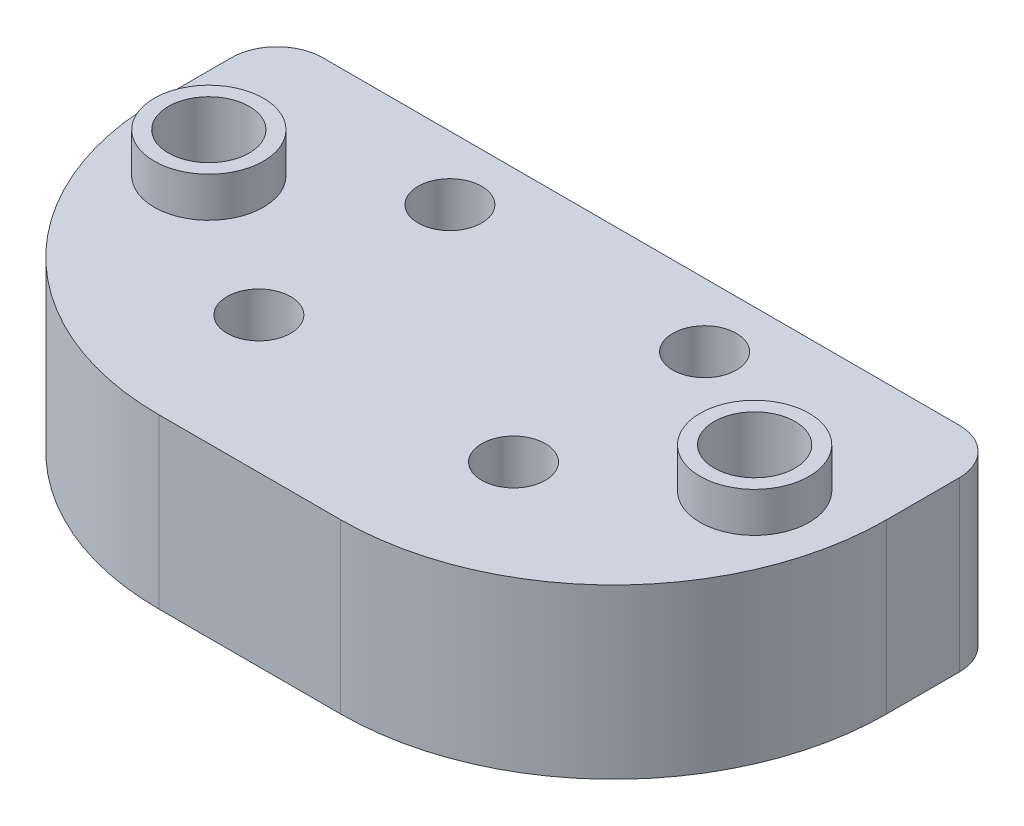
ISO-10303-21;
HEADER;
FILE_DESCRIPTION(('STEP AP214'),'2;1');
FILE_NAME('part.step','',(''),(''),'','','');
FILE_SCHEMA(('AUTOMOTIVE_DESIGN { 1 0 10303 214 1 1 1 1 }'));
ENDSEC;
DATA;
#1=APPLICATION_CONTEXT('core data for automotive mechanical design processes');
#2=APPLICATION_PROTOCOL_DEFINITION('international standard','automotive_design',2000,#1);
#3=PRODUCT_CONTEXT('',#1,'mechanical');
#4=PRODUCT('Part','Part','',(#3));
#5=PRODUCT_RELATED_PRODUCT_CATEGORY('part','',(#4));
#6=PRODUCT_DEFINITION_FORMATION('','',#4);
#7=PRODUCT_DEFINITION_CONTEXT('part definition',#1,'design');
#8=PRODUCT_DEFINITION('design','',#6,#7);
#9=PRODUCT_DEFINITION_SHAPE('','',#8);
#10=(LENGTH_UNIT() NAMED_UNIT(*) SI_UNIT(.MILLI.,.METRE.));
#11=(NAMED_UNIT(*) PLANE_ANGLE_UNIT() SI_UNIT($,.RADIAN.));
#12=(NAMED_UNIT(*) SI_UNIT($,.STERADIAN.) SOLID_ANGLE_UNIT());
#13=UNCERTAINTY_MEASURE_WITH_UNIT(LENGTH_MEASURE(1.E-05),#10,'distance_accuracy_value','');
#14=(GEOMETRIC_REPRESENTATION_CONTEXT(3) GLOBAL_UNCERTAINTY_ASSIGNED_CONTEXT((#13)) GLOBAL_UNIT_ASSIGNED_CONTEXT((#10,
#11,#12)) REPRESENTATION_CONTEXT('',''));
#15=CARTESIAN_POINT('',(0.,0.,0.));
#16=DIRECTION('',(0.,0.,1.));
#17=DIRECTION('',(1.,0.,0.));
#18=AXIS2_PLACEMENT_3D('',#15,#16,#17);
#19=CARTESIAN_POINT('',(80.,18.5,0.));
#20=DIRECTION('',(1.,0.,0.));
#21=DIRECTION('',(0.,0.,-1.));
#22=AXIS2_PLACEMENT_3D('',#19,#20,#21);
#23=PLANE('',#22);
#24=DIRECTION('',(0.,0.,1.));
#25=VECTOR('',#24,1.);
#26=CARTESIAN_POINT('',(80.,0.,0.));
#27=LINE('',#26,#25);
#28=CARTESIAN_POINT('',(80.,0.,13.));
#29=VERTEX_POINT('',#28);
#30=CARTESIAN_POINT('',(80.,0.,21.));
#31=VERTEX_POINT('',#30);
#32=EDGE_CURVE('E180',#29,#31,#27,.T.);
#33=ORIENTED_EDGE('',*,*,#32,.F.);
#34=DIRECTION('',(0.,-1.,0.));
#35=VECTOR('',#34,1.);
#36=CARTESIAN_POINT('',(80.,18.5,13.));
#37=LINE('',#36,#35);
#38=CARTESIAN_POINT('',(80.,18.5,13.));
#39=VERTEX_POINT('',#38);
#40=EDGE_CURVE('E11',#29,#39,#37,.F.);
#41=ORIENTED_EDGE('',*,*,#40,.T.);
#42=DIRECTION('',(0.,0.,1.));
#43=VECTOR('',#42,1.);
#44=CARTESIAN_POINT('',(80.,18.5,0.));
#45=LINE('',#44,#43);
#46=CARTESIAN_POINT('',(80.,18.5,21.));
#47=VERTEX_POINT('',#46);
#48=EDGE_CURVE('E137',#39,#47,#45,.T.);
#49=ORIENTED_EDGE('',*,*,#48,.T.);
#50=DIRECTION('',(0.,-1.,0.));
#51=VECTOR('',#50,1.);
#52=CARTESIAN_POINT('',(80.,0.,21.));
#53=LINE('',#52,#51);
#54=EDGE_CURVE('E147',#47,#31,#53,.T.);
#55=ORIENTED_EDGE('',*,*,#54,.T.);
#56=EDGE_LOOP('',(#33,#41,#49,#55));
#57=FACE_BOUND('',#56,.T.);
#58=ADVANCED_FACE('F34',(#57),#23,.T.);
#59=CARTESIAN_POINT('',(0.,18.5,7.99999999999999));
#60=DIRECTION('',(0.,0.,-1.));
#61=DIRECTION('',(-1.,0.,0.));
#62=AXIS2_PLACEMENT_3D('',#59,#60,#61);
#63=PLANE('',#62);
#64=DIRECTION('',(1.,0.,0.));
#65=VECTOR('',#64,1.);
#66=CARTESIAN_POINT('',(0.,0.,7.99999999999999));
#67=LINE('',#66,#65);
#68=CARTESIAN_POINT('',(5.,0.,7.99999999999999));
#69=VERTEX_POINT('',#68);
#70=CARTESIAN_POINT('',(75.,0.,7.99999999999999));
#71=VERTEX_POINT('',#70);
#72=EDGE_CURVE('E131',#69,#71,#67,.T.);
#73=ORIENTED_EDGE('',*,*,#72,.F.);
#74=DIRECTION('',(0.,-1.,0.));
#75=VECTOR('',#74,1.);
#76=CARTESIAN_POINT('',(5.,18.5,7.99999999999999));
#77=LINE('',#76,#75);
#78=CARTESIAN_POINT('',(5.,18.5,7.99999999999999));
#79=VERTEX_POINT('',#78);
#80=EDGE_CURVE('E160',#69,#79,#77,.F.);
#81=ORIENTED_EDGE('',*,*,#80,.T.);
#82=DIRECTION('',(1.,0.,0.));
#83=VECTOR('',#82,1.);
#84=CARTESIAN_POINT('',(0.,18.5,7.99999999999999));
#85=LINE('',#84,#83);
#86=CARTESIAN_POINT('',(75.,18.5,7.99999999999999));
#87=VERTEX_POINT('',#86);
#88=EDGE_CURVE('E167',#79,#87,#85,.T.);
#89=ORIENTED_EDGE('',*,*,#88,.T.);
#90=DIRECTION('',(0.,-1.,0.));
#91=VECTOR('',#90,1.);
#92=CARTESIAN_POINT('',(75.,18.5,7.99999999999999));
#93=LINE('',#92,#91);
#94=EDGE_CURVE('E157',#87,#71,#93,.T.);
#95=ORIENTED_EDGE('',*,*,#94,.T.);
#96=EDGE_LOOP('',(#73,#81,#89,#95));
#97=FACE_BOUND('',#96,.T.);
#98=ADVANCED_FACE('F178',(#97),#63,.T.);
#99=CARTESIAN_POINT('',(0.,18.5,0.));
#100=DIRECTION('',(1.,0.,0.));
#101=DIRECTION('',(0.,0.,-1.));
#102=AXIS2_PLACEMENT_3D('',#99,#100,#101);
#103=PLANE('',#102);
#104=DIRECTION('',(0.,0.,1.));
#105=VECTOR('',#104,1.);
#106=CARTESIAN_POINT('',(0.,18.5,0.));
#107=LINE('',#106,#105);
#108=CARTESIAN_POINT('',(0.,18.5,13.));
#109=VERTEX_POINT('',#108);
#110=CARTESIAN_POINT('',(0.,18.5,21.));
#111=VERTEX_POINT('',#110);
#112=EDGE_CURVE('E166',#109,#111,#107,.T.);
#113=ORIENTED_EDGE('',*,*,#112,.F.);
#114=DIRECTION('',(0.,-1.,0.));
#115=VECTOR('',#114,1.);
#116=CARTESIAN_POINT('',(0.,0.,13.));
#117=LINE('',#116,#115);
#118=CARTESIAN_POINT('',(0.,0.,13.));
#119=VERTEX_POINT('',#118);
#120=EDGE_CURVE('E150',#109,#119,#117,.T.);
#121=ORIENTED_EDGE('',*,*,#120,.T.);
#122=DIRECTION('',(0.,0.,1.));
#123=VECTOR('',#122,1.);
#124=CARTESIAN_POINT('',(0.,0.,0.));
#125=LINE('',#124,#123);
#126=CARTESIAN_POINT('',(0.,0.,21.));
#127=VERTEX_POINT('',#126);
#128=EDGE_CURVE('E126',#119,#127,#125,.T.);
#129=ORIENTED_EDGE('',*,*,#128,.T.);
#130=DIRECTION('',(0.,-1.,0.));
#131=VECTOR('',#130,1.);
#132=CARTESIAN_POINT('',(0.,18.5,21.));
#133=LINE('',#132,#131);
#134=EDGE_CURVE('E106',#127,#111,#133,.F.);
#135=ORIENTED_EDGE('',*,*,#134,.T.);
#136=EDGE_LOOP('',(#113,#121,#129,#135));
#137=FACE_BOUND('',#136,.T.);
#138=ADVANCED_FACE('F172',(#137),#103,.F.);
#139=CARTESIAN_POINT('',(26.,18.5,36.));
#140=DIRECTION('',(0.,-1.,0.));
#141=DIRECTION('',(0.,0.,-1.));
#142=AXIS2_PLACEMENT_3D('',#139,#140,#141);
#143=CYLINDRICAL_SURFACE('',#142,3.5);
#144=CARTESIAN_POINT('',(26.,6.,36.));
#145=DIRECTION('',(0.,1.,0.));
#146=DIRECTION('',(0.,0.,1.));
#147=AXIS2_PLACEMENT_3D('',#144,#145,#146);
#148=CIRCLE('',#147,3.5);
#149=CARTESIAN_POINT('',(26.,6.,39.5));
#150=VERTEX_POINT('',#149);
#151=EDGE_CURVE('E210',#150,#150,#148,.T.);
#152=ORIENTED_EDGE('',*,*,#151,.F.);
#153=EDGE_LOOP('',(#152));
#154=FACE_BOUND('',#153,.T.);
#155=CARTESIAN_POINT('',(26.,18.5,36.));
#156=DIRECTION('',(0.,1.,0.));
#157=DIRECTION('',(0.,0.,1.));
#158=AXIS2_PLACEMENT_3D('',#155,#156,#157);
#159=CIRCLE('',#158,3.5);
#160=CARTESIAN_POINT('',(26.,18.5,39.5));
#161=VERTEX_POINT('',#160);
#162=EDGE_CURVE('E186',#161,#161,#159,.T.);
#163=ORIENTED_EDGE('',*,*,#162,.T.);
#164=EDGE_LOOP('',(#163));
#165=FACE_BOUND('',#164,.T.);
#166=ADVANCED_FACE('F468',(#154,#165),#143,.F.);
#167=CARTESIAN_POINT('',(54.,18.5,15.));
#168=DIRECTION('',(0.,-1.,0.));
#169=DIRECTION('',(0.,0.,-1.));
#170=AXIS2_PLACEMENT_3D('',#167,#168,#169);
#171=CYLINDRICAL_SURFACE('',#170,3.5);
#172=CARTESIAN_POINT('',(54.,6.,15.));
#173=DIRECTION('',(0.,1.,0.));
#174=DIRECTION('',(0.,0.,1.));
#175=AXIS2_PLACEMENT_3D('',#172,#173,#174);
#176=CIRCLE('',#175,3.5);
#177=CARTESIAN_POINT('',(54.,6.,18.5));
#178=VERTEX_POINT('',#177);
#179=EDGE_CURVE('E229',#178,#178,#176,.T.);
#180=ORIENTED_EDGE('',*,*,#179,.F.);
#181=EDGE_LOOP('',(#180));
#182=FACE_BOUND('',#181,.T.);
#183=CARTESIAN_POINT('',(54.,18.5,15.));
#184=DIRECTION('',(0.,1.,0.));
#185=DIRECTION('',(0.,0.,1.));
#186=AXIS2_PLACEMENT_3D('',#183,#184,#185);
#187=CIRCLE('',#186,3.5);
#188=CARTESIAN_POINT('',(54.,18.5,18.5));
#189=VERTEX_POINT('',#188);
#190=EDGE_CURVE('E189',#189,#189,#187,.T.);
#191=ORIENTED_EDGE('',*,*,#190,.T.);
#192=EDGE_LOOP('',(#191));
#193=FACE_BOUND('',#192,.T.);
#194=ADVANCED_FACE('F477',(#182,#193),#171,.F.);
#195=CARTESIAN_POINT('',(26.,18.5,15.));
#196=DIRECTION('',(0.,-1.,0.));
#197=DIRECTION('',(0.,0.,-1.));
#198=AXIS2_PLACEMENT_3D('',#195,#196,#197);
#199=CYLINDRICAL_SURFACE('',#198,3.5);
#200=CARTESIAN_POINT('',(26.,6.,15.));
#201=DIRECTION('',(0.,1.,0.));
#202=DIRECTION('',(0.,0.,1.));
#203=AXIS2_PLACEMENT_3D('',#200,#201,#202);
#204=CIRCLE('',#203,3.5);
#205=CARTESIAN_POINT('',(26.,6.,18.5));
#206=VERTEX_POINT('',#205);
#207=EDGE_CURVE('E201',#206,#206,#204,.T.);
#208=ORIENTED_EDGE('',*,*,#207,.F.);
#209=EDGE_LOOP('',(#208));
#210=FACE_BOUND('',#209,.T.);
#211=CARTESIAN_POINT('',(26.,18.5,15.));
#212=DIRECTION('',(0.,1.,0.));
#213=DIRECTION('',(0.,0.,1.));
#214=AXIS2_PLACEMENT_3D('',#211,#212,#213);
#215=CIRCLE('',#214,3.5);
#216=CARTESIAN_POINT('',(26.,18.5,18.5));
#217=VERTEX_POINT('',#216);
#218=EDGE_CURVE('E192',#217,#217,#215,.T.);
#219=ORIENTED_EDGE('',*,*,#218,.T.);
#220=EDGE_LOOP('',(#219));
#221=FACE_BOUND('',#220,.T.);
#222=ADVANCED_FACE('F320',(#210,#221),#199,.F.);
#223=CARTESIAN_POINT('',(10.,18.5,25.5));
#224=DIRECTION('',(0.,-1.,0.));
#225=DIRECTION('',(0.,0.,-1.));
#226=AXIS2_PLACEMENT_3D('',#223,#224,#225);
#227=CYLINDRICAL_SURFACE('',#226,4.445);
#228=CARTESIAN_POINT('',(10.,0.,25.5));
#229=DIRECTION('',(0.,1.,0.));
#230=DIRECTION('',(0.,0.,1.));
#231=AXIS2_PLACEMENT_3D('',#228,#229,#230);
#232=CIRCLE('',#231,4.445);
#233=CARTESIAN_POINT('',(10.,0.,29.945));
#234=VERTEX_POINT('',#233);
#235=EDGE_CURVE('E129',#234,#234,#232,.T.);
#236=ORIENTED_EDGE('',*,*,#235,.F.);
#237=EDGE_LOOP('',(#236));
#238=FACE_BOUND('',#237,.T.);
#239=CARTESIAN_POINT('',(10.,22.8864,25.5));
#240=DIRECTION('',(0.,1.,0.));
#241=DIRECTION('',(0.,0.,1.));
#242=AXIS2_PLACEMENT_3D('',#239,#240,#241);
#243=CIRCLE('',#242,4.445);
#244=CARTESIAN_POINT('',(10.,22.8864,29.945));
#245=VERTEX_POINT('',#244);
#246=EDGE_CURVE('E246',#245,#245,#243,.T.);
#247=ORIENTED_EDGE('',*,*,#246,.T.);
#248=EDGE_LOOP('',(#247));
#249=FACE_BOUND('',#248,.T.);
#250=ADVANCED_FACE('F252',(#238,#249),#227,.F.);
#251=CARTESIAN_POINT('',(70.,18.5,25.5));
#252=DIRECTION('',(0.,-1.,0.));
#253=DIRECTION('',(0.,0.,-1.));
#254=AXIS2_PLACEMENT_3D('',#251,#252,#253);
#255=CYLINDRICAL_SURFACE('',#254,4.445);
#256=CARTESIAN_POINT('',(70.,0.,25.5));
#257=DIRECTION('',(0.,1.,0.));
#258=DIRECTION('',(0.,0.,1.));
#259=AXIS2_PLACEMENT_3D('',#256,#257,#258);
#260=CIRCLE('',#259,4.445);
#261=CARTESIAN_POINT('',(70.,0.,29.945));
#262=VERTEX_POINT('',#261);
#263=EDGE_CURVE('E125',#262,#262,#260,.T.);
#264=ORIENTED_EDGE('',*,*,#263,.F.);
#265=EDGE_LOOP('',(#264));
#266=FACE_BOUND('',#265,.T.);
#267=CARTESIAN_POINT('',(70.,22.8864,25.5));
#268=DIRECTION('',(0.,1.,0.));
#269=DIRECTION('',(0.,0.,1.));
#270=AXIS2_PLACEMENT_3D('',#267,#268,#269);
#271=CIRCLE('',#270,4.445);
#272=CARTESIAN_POINT('',(70.,22.8864,29.945));
#273=VERTEX_POINT('',#272);
#274=EDGE_CURVE('E237',#273,#273,#271,.T.);
#275=ORIENTED_EDGE('',*,*,#274,.T.);
#276=EDGE_LOOP('',(#275));
#277=FACE_BOUND('',#276,.T.);
#278=ADVANCED_FACE('F319',(#266,#277),#255,.F.);
#279=CARTESIAN_POINT('',(0.,18.5,51.));
#280=DIRECTION('',(0.,0.,-1.));
#281=DIRECTION('',(-1.,0.,0.));
#282=AXIS2_PLACEMENT_3D('',#279,#280,#281);
#283=PLANE('',#282);
#284=DIRECTION('',(1.,0.,0.));
#285=VECTOR('',#284,1.);
#286=CARTESIAN_POINT('',(0.,18.5,51.));
#287=LINE('',#286,#285);
#288=CARTESIAN_POINT('',(30.,18.5,51.));
#289=VERTEX_POINT('',#288);
#290=CARTESIAN_POINT('',(50.,18.5,51.));
#291=VERTEX_POINT('',#290);
#292=EDGE_CURVE('E119',#289,#291,#287,.T.);
#293=ORIENTED_EDGE('',*,*,#292,.F.);
#294=DIRECTION('',(0.,-1.,0.));
#295=VECTOR('',#294,1.);
#296=CARTESIAN_POINT('',(30.,18.5,51.));
#297=LINE('',#296,#295);
#298=CARTESIAN_POINT('',(30.,0.,51.));
#299=VERTEX_POINT('',#298);
#300=EDGE_CURVE('E104',#289,#299,#297,.T.);
#301=ORIENTED_EDGE('',*,*,#300,.T.);
#302=DIRECTION('',(1.,0.,0.));
#303=VECTOR('',#302,1.);
#304=CARTESIAN_POINT('',(0.,0.,51.));
#305=LINE('',#304,#303);
#306=CARTESIAN_POINT('',(50.,0.,51.));
#307=VERTEX_POINT('',#306);
#308=EDGE_CURVE('E116',#299,#307,#305,.T.);
#309=ORIENTED_EDGE('',*,*,#308,.T.);
#310=DIRECTION('',(0.,-1.,0.));
#311=VECTOR('',#310,1.);
#312=CARTESIAN_POINT('',(50.,18.5,51.));
#313=LINE('',#312,#311);
#314=EDGE_CURVE('E120',#307,#291,#313,.F.);
#315=ORIENTED_EDGE('',*,*,#314,.T.);
#316=EDGE_LOOP('',(#293,#301,#309,#315));
#317=FACE_BOUND('',#316,.T.);
#318=ADVANCED_FACE('F115',(#317),#283,.F.);
#319=CARTESIAN_POINT('',(54.,18.5,36.));
#320=DIRECTION('',(0.,-1.,0.));
#321=DIRECTION('',(0.,0.,-1.));
#322=AXIS2_PLACEMENT_3D('',#319,#320,#321);
#323=CYLINDRICAL_SURFACE('',#322,3.5);
#324=CARTESIAN_POINT('',(54.,6.,36.));
#325=DIRECTION('',(0.,1.,0.));
#326=DIRECTION('',(0.,0.,1.));
#327=AXIS2_PLACEMENT_3D('',#324,#325,#326);
#328=CIRCLE('',#327,3.5);
#329=CARTESIAN_POINT('',(54.,6.,39.5));
#330=VERTEX_POINT('',#329);
#331=EDGE_CURVE('E220',#330,#330,#328,.T.);
#332=ORIENTED_EDGE('',*,*,#331,.F.);
#333=EDGE_LOOP('',(#332));
#334=FACE_BOUND('',#333,.T.);
#335=CARTESIAN_POINT('',(54.,18.5,36.));
#336=DIRECTION('',(0.,1.,0.));
#337=DIRECTION('',(0.,0.,1.));
#338=AXIS2_PLACEMENT_3D('',#335,#336,#337);
#339=CIRCLE('',#338,3.5);
#340=CARTESIAN_POINT('',(54.,18.5,39.5));
#341=VERTEX_POINT('',#340);
#342=EDGE_CURVE('E138',#341,#341,#339,.T.);
#343=ORIENTED_EDGE('',*,*,#342,.T.);
#344=EDGE_LOOP('',(#343));
#345=FACE_BOUND('',#344,.T.);
#346=ADVANCED_FACE('F269',(#334,#345),#323,.F.);
#347=CARTESIAN_POINT('',(0.,18.5,0.));
#348=DIRECTION('',(0.,1.,0.));
#349=DIRECTION('',(0.,0.,1.));
#350=AXIS2_PLACEMENT_3D('',#347,#348,#349);
#351=PLANE('',#350);
#352=CARTESIAN_POINT('',(10.,18.5,25.5));
#353=DIRECTION('',(0.,1.,0.));
#354=DIRECTION('',(0.,0.,1.));
#355=AXIS2_PLACEMENT_3D('',#352,#353,#354);
#356=CIRCLE('',#355,6.);
#357=CARTESIAN_POINT('',(10.,18.5,31.5));
#358=VERTEX_POINT('',#357);
#359=EDGE_CURVE('E243',#358,#358,#356,.T.);
#360=ORIENTED_EDGE('',*,*,#359,.F.);
#361=EDGE_LOOP('',(#360));
#362=FACE_BOUND('',#361,.T.);
#363=CARTESIAN_POINT('',(70.,18.5,25.5));
#364=DIRECTION('',(0.,1.,0.));
#365=DIRECTION('',(0.,0.,1.));
#366=AXIS2_PLACEMENT_3D('',#363,#364,#365);
#367=CIRCLE('',#366,6.);
#368=CARTESIAN_POINT('',(70.,18.5,31.5));
#369=VERTEX_POINT('',#368);
#370=EDGE_CURVE('E234',#369,#369,#367,.T.);
#371=ORIENTED_EDGE('',*,*,#370,.F.);
#372=EDGE_LOOP('',(#371));
#373=FACE_BOUND('',#372,.T.);
#374=ORIENTED_EDGE('',*,*,#88,.F.);
#375=CARTESIAN_POINT('',(5.,18.5,13.));
#376=DIRECTION('',(0.,1.,0.));
#377=DIRECTION('',(0.,0.,1.));
#378=AXIS2_PLACEMENT_3D('',#375,#376,#377);
#379=CIRCLE('',#378,5.);
#380=EDGE_CURVE('E42',#79,#109,#379,.T.);
#381=ORIENTED_EDGE('',*,*,#380,.T.);
#382=ORIENTED_EDGE('',*,*,#112,.T.);
#383=CARTESIAN_POINT('',(30.,18.5,21.));
#384=DIRECTION('',(0.,1.,0.));
#385=DIRECTION('',(0.,0.,1.));
#386=AXIS2_PLACEMENT_3D('',#383,#384,#385);
#387=CIRCLE('',#386,30.);
#388=EDGE_CURVE('E145',#111,#289,#387,.T.);
#389=ORIENTED_EDGE('',*,*,#388,.T.);
#390=ORIENTED_EDGE('',*,*,#292,.T.);
#391=CARTESIAN_POINT('',(50.,18.5,21.));
#392=DIRECTION('',(0.,1.,0.));
#393=DIRECTION('',(0.,0.,1.));
#394=AXIS2_PLACEMENT_3D('',#391,#392,#393);
#395=CIRCLE('',#394,30.);
#396=EDGE_CURVE('E142',#291,#47,#395,.T.);
#397=ORIENTED_EDGE('',*,*,#396,.T.);
#398=ORIENTED_EDGE('',*,*,#48,.F.);
#399=CARTESIAN_POINT('',(75.,18.5,13.));
#400=DIRECTION('',(0.,1.,0.));
#401=DIRECTION('',(0.,0.,1.));
#402=AXIS2_PLACEMENT_3D('',#399,#400,#401);
#403=CIRCLE('',#402,5.);
#404=EDGE_CURVE('E54',#39,#87,#403,.T.);
#405=ORIENTED_EDGE('',*,*,#404,.T.);
#406=EDGE_LOOP('',(#374,#381,#382,#389,#390,#397,#398,#405));
#407=FACE_BOUND('',#406,.T.);
#408=ORIENTED_EDGE('',*,*,#218,.F.);
#409=EDGE_LOOP('',(#408));
#410=FACE_BOUND('',#409,.T.);
#411=ORIENTED_EDGE('',*,*,#190,.F.);
#412=EDGE_LOOP('',(#411));
#413=FACE_BOUND('',#412,.T.);
#414=ORIENTED_EDGE('',*,*,#162,.F.);
#415=EDGE_LOOP('',(#414));
#416=FACE_BOUND('',#415,.T.);
#417=ORIENTED_EDGE('',*,*,#342,.F.);
#418=EDGE_LOOP('',(#417));
#419=FACE_BOUND('',#418,.T.);
#420=ADVANCED_FACE('F164',(#362,#373,#407,#410,#413,#416,#419),#351,.T.);
#421=CARTESIAN_POINT('',(0.,0.,0.));
#422=DIRECTION('',(0.,1.,0.));
#423=DIRECTION('',(0.,0.,1.));
#424=AXIS2_PLACEMENT_3D('',#421,#422,#423);
#425=PLANE('',#424);
#426=CARTESIAN_POINT('',(26.,0.,36.));
#427=DIRECTION('',(0.,1.,0.));
#428=DIRECTION('',(0.,0.,1.));
#429=AXIS2_PLACEMENT_3D('',#426,#427,#428);
#430=CIRCLE('',#429,4.35);
#431=CARTESIAN_POINT('',(26.,0.,40.35));
#432=VERTEX_POINT('',#431);
#433=EDGE_CURVE('E207',#432,#432,#430,.T.);
#434=ORIENTED_EDGE('',*,*,#433,.T.);
#435=EDGE_LOOP('',(#434));
#436=FACE_BOUND('',#435,.T.);
#437=CARTESIAN_POINT('',(54.,0.,36.));
#438=DIRECTION('',(0.,1.,0.));
#439=DIRECTION('',(0.,0.,1.));
#440=AXIS2_PLACEMENT_3D('',#437,#438,#439);
#441=CIRCLE('',#440,4.35);
#442=CARTESIAN_POINT('',(54.,0.,40.35));
#443=VERTEX_POINT('',#442);
#444=EDGE_CURVE('E215',#443,#443,#441,.T.);
#445=ORIENTED_EDGE('',*,*,#444,.T.);
#446=EDGE_LOOP('',(#445));
#447=FACE_BOUND('',#446,.T.);
#448=CARTESIAN_POINT('',(54.,0.,15.));
#449=DIRECTION('',(0.,1.,0.));
#450=DIRECTION('',(0.,0.,1.));
#451=AXIS2_PLACEMENT_3D('',#448,#449,#450);
#452=CIRCLE('',#451,4.35);
#453=CARTESIAN_POINT('',(54.,0.,19.35));
#454=VERTEX_POINT('',#453);
#455=EDGE_CURVE('E224',#454,#454,#452,.T.);
#456=ORIENTED_EDGE('',*,*,#455,.T.);
#457=EDGE_LOOP('',(#456));
#458=FACE_BOUND('',#457,.T.);
#459=CARTESIAN_POINT('',(26.,0.,15.));
#460=DIRECTION('',(0.,1.,0.));
#461=DIRECTION('',(0.,0.,1.));
#462=AXIS2_PLACEMENT_3D('',#459,#460,#461);
#463=CIRCLE('',#462,4.35);
#464=CARTESIAN_POINT('',(26.,0.,19.35));
#465=VERTEX_POINT('',#464);
#466=EDGE_CURVE('E198',#465,#465,#463,.T.);
#467=ORIENTED_EDGE('',*,*,#466,.T.);
#468=EDGE_LOOP('',(#467));
#469=FACE_BOUND('',#468,.T.);
#470=ORIENTED_EDGE('',*,*,#128,.F.);
#471=CARTESIAN_POINT('',(5.,0.,13.));
#472=DIRECTION('',(0.,1.,0.));
#473=DIRECTION('',(0.,0.,1.));
#474=AXIS2_PLACEMENT_3D('',#471,#472,#473);
#475=CIRCLE('',#474,5.);
#476=EDGE_CURVE('E155',#119,#69,#475,.F.);
#477=ORIENTED_EDGE('',*,*,#476,.T.);
#478=ORIENTED_EDGE('',*,*,#72,.T.);
#479=CARTESIAN_POINT('',(75.,0.,13.));
#480=DIRECTION('',(0.,1.,0.));
#481=DIRECTION('',(0.,0.,1.));
#482=AXIS2_PLACEMENT_3D('',#479,#480,#481);
#483=CIRCLE('',#482,5.);
#484=EDGE_CURVE('E153',#71,#29,#483,.F.);
#485=ORIENTED_EDGE('',*,*,#484,.T.);
#486=ORIENTED_EDGE('',*,*,#32,.T.);
#487=CARTESIAN_POINT('',(50.,0.,21.));
#488=DIRECTION('',(0.,1.,0.));
#489=DIRECTION('',(0.,0.,1.));
#490=AXIS2_PLACEMENT_3D('',#487,#488,#489);
#491=CIRCLE('',#490,30.);
#492=EDGE_CURVE('E110',#31,#307,#491,.F.);
#493=ORIENTED_EDGE('',*,*,#492,.T.);
#494=ORIENTED_EDGE('',*,*,#308,.F.);
#495=CARTESIAN_POINT('',(30.,0.,21.));
#496=DIRECTION('',(0.,1.,0.));
#497=DIRECTION('',(0.,0.,1.));
#498=AXIS2_PLACEMENT_3D('',#495,#496,#497);
#499=CIRCLE('',#498,30.);
#500=EDGE_CURVE('E100',#299,#127,#499,.F.);
#501=ORIENTED_EDGE('',*,*,#500,.T.);
#502=EDGE_LOOP('',(#470,#477,#478,#485,#486,#493,#494,#501));
#503=FACE_BOUND('',#502,.T.);
#504=ORIENTED_EDGE('',*,*,#263,.T.);
#505=EDGE_LOOP('',(#504));
#506=FACE_BOUND('',#505,.T.);
#507=ORIENTED_EDGE('',*,*,#235,.T.);
#508=EDGE_LOOP('',(#507));
#509=FACE_BOUND('',#508,.T.);
#510=ADVANCED_FACE('F122',(#436,#447,#458,#469,#503,#506,#509),#425,.F.);
#511=CARTESIAN_POINT('',(26.,6.,15.));
#512=DIRECTION('',(0.,-1.,0.));
#513=DIRECTION('',(0.,0.,-1.));
#514=AXIS2_PLACEMENT_3D('',#511,#512,#513);
#515=CYLINDRICAL_SURFACE('',#514,4.35);
#516=CARTESIAN_POINT('',(26.,6.,15.));
#517=DIRECTION('',(0.,1.,0.));
#518=DIRECTION('',(0.,0.,1.));
#519=AXIS2_PLACEMENT_3D('',#516,#517,#518);
#520=CIRCLE('',#519,4.35);
#521=CARTESIAN_POINT('',(26.,6.,19.35));
#522=VERTEX_POINT('',#521);
#523=EDGE_CURVE('E181',#522,#522,#520,.T.);
#524=ORIENTED_EDGE('',*,*,#523,.T.);
#525=EDGE_LOOP('',(#524));
#526=FACE_BOUND('',#525,.T.);
#527=ORIENTED_EDGE('',*,*,#466,.F.);
#528=EDGE_LOOP('',(#527));
#529=FACE_BOUND('',#528,.T.);
#530=ADVANCED_FACE('F374',(#526,#529),#515,.F.);
#531=CARTESIAN_POINT('',(0.,6.,0.));
#532=DIRECTION('',(0.,1.,0.));
#533=DIRECTION('',(0.,0.,1.));
#534=AXIS2_PLACEMENT_3D('',#531,#532,#533);
#535=PLANE('',#534);
#536=ORIENTED_EDGE('',*,*,#207,.T.);
#537=EDGE_LOOP('',(#536));
#538=FACE_BOUND('',#537,.T.);
#539=ORIENTED_EDGE('',*,*,#523,.F.);
#540=EDGE_LOOP('',(#539));
#541=FACE_BOUND('',#540,.T.);
#542=ADVANCED_FACE('F383',(#538,#541),#535,.F.);
#543=CARTESIAN_POINT('',(54.,6.,15.));
#544=DIRECTION('',(0.,-1.,0.));
#545=DIRECTION('',(0.,0.,-1.));
#546=AXIS2_PLACEMENT_3D('',#543,#544,#545);
#547=CYLINDRICAL_SURFACE('',#546,4.35);
#548=CARTESIAN_POINT('',(54.,6.,15.));
#549=DIRECTION('',(0.,1.,0.));
#550=DIRECTION('',(0.,0.,1.));
#551=AXIS2_PLACEMENT_3D('',#548,#549,#550);
#552=CIRCLE('',#551,4.35);
#553=CARTESIAN_POINT('',(54.,6.,19.35));
#554=VERTEX_POINT('',#553);
#555=EDGE_CURVE('E202',#554,#554,#552,.T.);
#556=ORIENTED_EDGE('',*,*,#555,.T.);
#557=EDGE_LOOP('',(#556));
#558=FACE_BOUND('',#557,.T.);
#559=ORIENTED_EDGE('',*,*,#455,.F.);
#560=EDGE_LOOP('',(#559));
#561=FACE_BOUND('',#560,.T.);
#562=ADVANCED_FACE('F391',(#558,#561),#547,.F.);
#563=CARTESIAN_POINT('',(0.,6.,0.));
#564=DIRECTION('',(0.,1.,0.));
#565=DIRECTION('',(0.,0.,1.));
#566=AXIS2_PLACEMENT_3D('',#563,#564,#565);
#567=PLANE('',#566);
#568=ORIENTED_EDGE('',*,*,#179,.T.);
#569=EDGE_LOOP('',(#568));
#570=FACE_BOUND('',#569,.T.);
#571=ORIENTED_EDGE('',*,*,#555,.F.);
#572=EDGE_LOOP('',(#571));
#573=FACE_BOUND('',#572,.T.);
#574=ADVANCED_FACE('F399',(#570,#573),#567,.F.);
#575=CARTESIAN_POINT('',(54.,6.,36.));
#576=DIRECTION('',(0.,-1.,0.));
#577=DIRECTION('',(0.,0.,-1.));
#578=AXIS2_PLACEMENT_3D('',#575,#576,#577);
#579=CYLINDRICAL_SURFACE('',#578,4.35);
#580=CARTESIAN_POINT('',(54.,6.,36.));
#581=DIRECTION('',(0.,1.,0.));
#582=DIRECTION('',(0.,0.,1.));
#583=AXIS2_PLACEMENT_3D('',#580,#581,#582);
#584=CIRCLE('',#583,4.35);
#585=CARTESIAN_POINT('',(54.,6.,40.35));
#586=VERTEX_POINT('',#585);
#587=EDGE_CURVE('E221',#586,#586,#584,.T.);
#588=ORIENTED_EDGE('',*,*,#587,.T.);
#589=EDGE_LOOP('',(#588));
#590=FACE_BOUND('',#589,.T.);
#591=ORIENTED_EDGE('',*,*,#444,.F.);
#592=EDGE_LOOP('',(#591));
#593=FACE_BOUND('',#592,.T.);
#594=ADVANCED_FACE('F407',(#590,#593),#579,.F.);
#595=CARTESIAN_POINT('',(0.,6.,0.));
#596=DIRECTION('',(0.,1.,0.));
#597=DIRECTION('',(0.,0.,1.));
#598=AXIS2_PLACEMENT_3D('',#595,#596,#597);
#599=PLANE('',#598);
#600=ORIENTED_EDGE('',*,*,#331,.T.);
#601=EDGE_LOOP('',(#600));
#602=FACE_BOUND('',#601,.T.);
#603=ORIENTED_EDGE('',*,*,#587,.F.);
#604=EDGE_LOOP('',(#603));
#605=FACE_BOUND('',#604,.T.);
#606=ADVANCED_FACE('F414',(#602,#605),#599,.F.);
#607=CARTESIAN_POINT('',(26.,6.,36.));
#608=DIRECTION('',(0.,-1.,0.));
#609=DIRECTION('',(0.,0.,-1.));
#610=AXIS2_PLACEMENT_3D('',#607,#608,#609);
#611=CYLINDRICAL_SURFACE('',#610,4.35);
#612=CARTESIAN_POINT('',(26.,6.,36.));
#613=DIRECTION('',(0.,1.,0.));
#614=DIRECTION('',(0.,0.,1.));
#615=AXIS2_PLACEMENT_3D('',#612,#613,#614);
#616=CIRCLE('',#615,4.35);
#617=CARTESIAN_POINT('',(26.,6.,40.35));
#618=VERTEX_POINT('',#617);
#619=EDGE_CURVE('E212',#618,#618,#616,.T.);
#620=ORIENTED_EDGE('',*,*,#619,.T.);
#621=EDGE_LOOP('',(#620));
#622=FACE_BOUND('',#621,.T.);
#623=ORIENTED_EDGE('',*,*,#433,.F.);
#624=EDGE_LOOP('',(#623));
#625=FACE_BOUND('',#624,.T.);
#626=ADVANCED_FACE('F422',(#622,#625),#611,.F.);
#627=CARTESIAN_POINT('',(0.,6.,0.));
#628=DIRECTION('',(0.,1.,0.));
#629=DIRECTION('',(0.,0.,1.));
#630=AXIS2_PLACEMENT_3D('',#627,#628,#629);
#631=PLANE('',#630);
#632=ORIENTED_EDGE('',*,*,#151,.T.);
#633=EDGE_LOOP('',(#632));
#634=FACE_BOUND('',#633,.T.);
#635=ORIENTED_EDGE('',*,*,#619,.F.);
#636=EDGE_LOOP('',(#635));
#637=FACE_BOUND('',#636,.T.);
#638=ADVANCED_FACE('F297',(#634,#637),#631,.F.);
#639=CARTESIAN_POINT('',(30.,18.5,21.));
#640=DIRECTION('',(0.,-1.,0.));
#641=DIRECTION('',(0.,0.,-1.));
#642=AXIS2_PLACEMENT_3D('',#639,#640,#641);
#643=CYLINDRICAL_SURFACE('',#642,30.);
#644=ORIENTED_EDGE('',*,*,#388,.F.);
#645=ORIENTED_EDGE('',*,*,#134,.F.);
#646=ORIENTED_EDGE('',*,*,#500,.F.);
#647=ORIENTED_EDGE('',*,*,#300,.F.);
#648=EDGE_LOOP('',(#644,#645,#646,#647));
#649=FACE_BOUND('',#648,.T.);
#650=ADVANCED_FACE('F103',(#649),#643,.T.);
#651=CARTESIAN_POINT('',(50.,18.5,21.));
#652=DIRECTION('',(0.,1.,0.));
#653=DIRECTION('',(0.,0.,1.));
#654=AXIS2_PLACEMENT_3D('',#651,#652,#653);
#655=CYLINDRICAL_SURFACE('',#654,30.);
#656=ORIENTED_EDGE('',*,*,#396,.F.);
#657=ORIENTED_EDGE('',*,*,#314,.F.);
#658=ORIENTED_EDGE('',*,*,#492,.F.);
#659=ORIENTED_EDGE('',*,*,#54,.F.);
#660=EDGE_LOOP('',(#656,#657,#658,#659));
#661=FACE_BOUND('',#660,.T.);
#662=ADVANCED_FACE('F296',(#661),#655,.T.);
#663=CARTESIAN_POINT('',(5.,18.5,13.));
#664=DIRECTION('',(0.,1.,0.));
#665=DIRECTION('',(0.,0.,1.));
#666=AXIS2_PLACEMENT_3D('',#663,#664,#665);
#667=CYLINDRICAL_SURFACE('',#666,5.);
#668=ORIENTED_EDGE('',*,*,#380,.F.);
#669=ORIENTED_EDGE('',*,*,#80,.F.);
#670=ORIENTED_EDGE('',*,*,#476,.F.);
#671=ORIENTED_EDGE('',*,*,#120,.F.);
#672=EDGE_LOOP('',(#668,#669,#670,#671));
#673=FACE_BOUND('',#672,.T.);
#674=ADVANCED_FACE('F174',(#673),#667,.T.);
#675=CARTESIAN_POINT('',(75.,18.5,13.));
#676=DIRECTION('',(0.,-1.,0.));
#677=DIRECTION('',(0.,0.,-1.));
#678=AXIS2_PLACEMENT_3D('',#675,#676,#677);
#679=CYLINDRICAL_SURFACE('',#678,5.);
#680=ORIENTED_EDGE('',*,*,#404,.F.);
#681=ORIENTED_EDGE('',*,*,#40,.F.);
#682=ORIENTED_EDGE('',*,*,#484,.F.);
#683=ORIENTED_EDGE('',*,*,#94,.F.);
#684=EDGE_LOOP('',(#680,#681,#682,#683));
#685=FACE_BOUND('',#684,.T.);
#686=ADVANCED_FACE('F36',(#685),#679,.T.);
#687=CARTESIAN_POINT('',(70.,22.8864,25.5));
#688=DIRECTION('',(0.,-1.,0.));
#689=DIRECTION('',(0.,0.,-1.));
#690=AXIS2_PLACEMENT_3D('',#687,#688,#689);
#691=CYLINDRICAL_SURFACE('',#690,6.);
#692=CARTESIAN_POINT('',(70.,22.8864,25.5));
#693=DIRECTION('',(0.,1.,0.));
#694=DIRECTION('',(0.,0.,1.));
#695=AXIS2_PLACEMENT_3D('',#692,#693,#694);
#696=CIRCLE('',#695,6.);
#697=CARTESIAN_POINT('',(70.,22.8864,31.5));
#698=VERTEX_POINT('',#697);
#699=EDGE_CURVE('E211',#698,#698,#696,.T.);
#700=ORIENTED_EDGE('',*,*,#699,.F.);
#701=EDGE_LOOP('',(#700));
#702=FACE_BOUND('',#701,.T.);
#703=ORIENTED_EDGE('',*,*,#370,.T.);
#704=EDGE_LOOP('',(#703));
#705=FACE_BOUND('',#704,.T.);
#706=ADVANCED_FACE('F273',(#702,#705),#691,.T.);
#707=CARTESIAN_POINT('',(0.,22.8864,0.));
#708=DIRECTION('',(0.,1.,0.));
#709=DIRECTION('',(0.,0.,1.));
#710=AXIS2_PLACEMENT_3D('',#707,#708,#709);
#711=PLANE('',#710);
#712=ORIENTED_EDGE('',*,*,#274,.F.);
#713=EDGE_LOOP('',(#712));
#714=FACE_BOUND('',#713,.T.);
#715=ORIENTED_EDGE('',*,*,#699,.T.);
#716=EDGE_LOOP('',(#715));
#717=FACE_BOUND('',#716,.T.);
#718=ADVANCED_FACE('F263',(#714,#717),#711,.T.);
#719=CARTESIAN_POINT('',(10.,22.8864,25.5));
#720=DIRECTION('',(0.,-1.,0.));
#721=DIRECTION('',(0.,0.,-1.));
#722=AXIS2_PLACEMENT_3D('',#719,#720,#721);
#723=CYLINDRICAL_SURFACE('',#722,6.);
#724=CARTESIAN_POINT('',(10.,22.8864,25.5));
#725=DIRECTION('',(0.,1.,0.));
#726=DIRECTION('',(0.,0.,1.));
#727=AXIS2_PLACEMENT_3D('',#724,#725,#726);
#728=CIRCLE('',#727,6.);
#729=CARTESIAN_POINT('',(10.,22.8864,31.5));
#730=VERTEX_POINT('',#729);
#731=EDGE_CURVE('E238',#730,#730,#728,.T.);
#732=ORIENTED_EDGE('',*,*,#731,.F.);
#733=EDGE_LOOP('',(#732));
#734=FACE_BOUND('',#733,.T.);
#735=ORIENTED_EDGE('',*,*,#359,.T.);
#736=EDGE_LOOP('',(#735));
#737=FACE_BOUND('',#736,.T.);
#738=ADVANCED_FACE('F257',(#734,#737),#723,.T.);
#739=CARTESIAN_POINT('',(0.,22.8864,0.));
#740=DIRECTION('',(0.,1.,0.));
#741=DIRECTION('',(0.,0.,1.));
#742=AXIS2_PLACEMENT_3D('',#739,#740,#741);
#743=PLANE('',#742);
#744=ORIENTED_EDGE('',*,*,#246,.F.);
#745=EDGE_LOOP('',(#744));
#746=FACE_BOUND('',#745,.T.);
#747=ORIENTED_EDGE('',*,*,#731,.T.);
#748=EDGE_LOOP('',(#747));
#749=FACE_BOUND('',#748,.T.);
#750=ADVANCED_FACE('F254',(#746,#749),#743,.T.);
#751=CLOSED_SHELL('',(#58,#98,#138,#166,#194,#222,#250,#278,#318,#346,#420,#510,#530,#542,#562,
#574,#594,#606,#626,#638,#650,#662,#674,#686,#706,#718,#738,#750));
#752=MANIFOLD_SOLID_BREP('B2',#751);
#753=ADVANCED_BREP_SHAPE_REPRESENTATION('',(#18,#752),#14);
#754=SHAPE_DEFINITION_REPRESENTATION(#9,#753);
ENDSEC;
END-ISO-10303-21;
